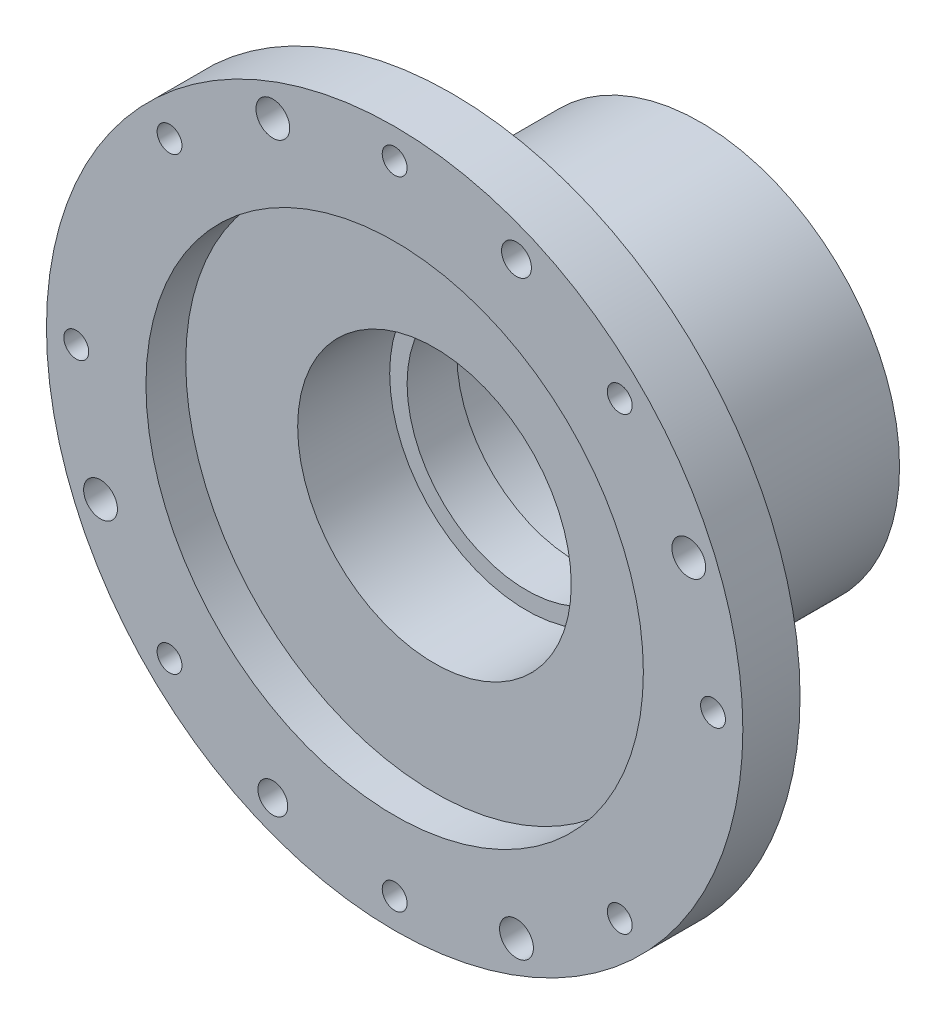
ISO-10303-21;
HEADER;
FILE_DESCRIPTION(('STEP AP214'),'2;1');
FILE_NAME('part.step','',(''),(''),'','','');
FILE_SCHEMA(('AUTOMOTIVE_DESIGN { 1 0 10303 214 1 1 1 1 }'));
ENDSEC;
DATA;
#1=APPLICATION_CONTEXT('core data for automotive mechanical design processes');
#2=APPLICATION_PROTOCOL_DEFINITION('international standard','automotive_design',2000,#1);
#3=PRODUCT_CONTEXT('',#1,'mechanical');
#4=PRODUCT('Part','Part','',(#3));
#5=PRODUCT_RELATED_PRODUCT_CATEGORY('part','',(#4));
#6=PRODUCT_DEFINITION_FORMATION('','',#4);
#7=PRODUCT_DEFINITION_CONTEXT('part definition',#1,'design');
#8=PRODUCT_DEFINITION('design','',#6,#7);
#9=PRODUCT_DEFINITION_SHAPE('','',#8);
#10=(LENGTH_UNIT() NAMED_UNIT(*) SI_UNIT(.MILLI.,.METRE.));
#11=(NAMED_UNIT(*) PLANE_ANGLE_UNIT() SI_UNIT($,.RADIAN.));
#12=(NAMED_UNIT(*) SI_UNIT($,.STERADIAN.) SOLID_ANGLE_UNIT());
#13=UNCERTAINTY_MEASURE_WITH_UNIT(LENGTH_MEASURE(1.E-05),#10,'distance_accuracy_value','');
#14=(GEOMETRIC_REPRESENTATION_CONTEXT(3) GLOBAL_UNCERTAINTY_ASSIGNED_CONTEXT((#13)) GLOBAL_UNIT_ASSIGNED_CONTEXT((#10,
#11,#12)) REPRESENTATION_CONTEXT('',''));
#15=CARTESIAN_POINT('',(0.,0.,0.));
#16=DIRECTION('',(0.,0.,1.));
#17=DIRECTION('',(1.,0.,0.));
#18=AXIS2_PLACEMENT_3D('',#15,#16,#17);
#19=CARTESIAN_POINT('',(0.,0.,150.));
#20=DIRECTION('',(0.,0.,1.));
#21=DIRECTION('',(1.,0.,0.));
#22=AXIS2_PLACEMENT_3D('',#19,#20,#21);
#23=CYLINDRICAL_SURFACE('',#22,27.5);
#24=CARTESIAN_POINT('',(0.,0.,-71.));
#25=DIRECTION('',(0.,0.,1.));
#26=DIRECTION('',(1.,0.,0.));
#27=AXIS2_PLACEMENT_3D('',#24,#25,#26);
#28=CIRCLE('',#27,27.5);
#29=CARTESIAN_POINT('',(27.5,0.,-71.));
#30=VERTEX_POINT('',#29);
#31=EDGE_CURVE('E142',#30,#30,#28,.T.);
#32=ORIENTED_EDGE('',*,*,#31,.T.);
#33=EDGE_LOOP('',(#32));
#34=FACE_BOUND('',#33,.T.);
#35=CARTESIAN_POINT('',(0.,0.,-96.));
#36=DIRECTION('',(0.,0.,1.));
#37=DIRECTION('',(1.,0.,0.));
#38=AXIS2_PLACEMENT_3D('',#35,#36,#37);
#39=CIRCLE('',#38,27.5);
#40=CARTESIAN_POINT('',(27.5,0.,-96.));
#41=VERTEX_POINT('',#40);
#42=EDGE_CURVE('E10',#41,#41,#39,.T.);
#43=ORIENTED_EDGE('',*,*,#42,.F.);
#44=EDGE_LOOP('',(#43));
#45=FACE_BOUND('',#44,.T.);
#46=ADVANCED_FACE('F39',(#34,#45),#23,.F.);
#47=CARTESIAN_POINT('',(27.5,0.,-96.));
#48=DIRECTION('',(0.,0.,-1.));
#49=DIRECTION('',(-1.,0.,0.));
#50=AXIS2_PLACEMENT_3D('',#47,#48,#49);
#51=PLANE('',#50);
#52=CARTESIAN_POINT('',(-23.8649,-23.8649,-96.));
#53=DIRECTION('',(0.,0.,-1.));
#54=DIRECTION('',(-1.,0.,0.));
#55=AXIS2_PLACEMENT_3D('',#52,#53,#54);
#56=CIRCLE('',#55,1.65);
#57=CARTESIAN_POINT('',(-25.5149,-23.8649,-96.));
#58=VERTEX_POINT('',#57);
#59=EDGE_CURVE('E511',#58,#58,#56,.T.);
#60=ORIENTED_EDGE('',*,*,#59,.F.);
#61=EDGE_LOOP('',(#60));
#62=FACE_BOUND('',#61,.T.);
#63=CARTESIAN_POINT('',(23.8649,-23.8649,-96.));
#64=DIRECTION('',(0.,0.,-1.));
#65=DIRECTION('',(-1.,0.,0.));
#66=AXIS2_PLACEMENT_3D('',#63,#64,#65);
#67=CIRCLE('',#66,1.65);
#68=CARTESIAN_POINT('',(22.2149,-23.8649,-96.));
#69=VERTEX_POINT('',#68);
#70=EDGE_CURVE('E645',#69,#69,#67,.T.);
#71=ORIENTED_EDGE('',*,*,#70,.F.);
#72=EDGE_LOOP('',(#71));
#73=FACE_BOUND('',#72,.T.);
#74=CARTESIAN_POINT('',(23.8649,23.8649,-96.));
#75=DIRECTION('',(0.,0.,-1.));
#76=DIRECTION('',(-1.,0.,0.));
#77=AXIS2_PLACEMENT_3D('',#74,#75,#76);
#78=CIRCLE('',#77,1.65);
#79=CARTESIAN_POINT('',(22.2149,23.8649,-96.));
#80=VERTEX_POINT('',#79);
#81=EDGE_CURVE('E527',#80,#80,#78,.T.);
#82=ORIENTED_EDGE('',*,*,#81,.F.);
#83=EDGE_LOOP('',(#82));
#84=FACE_BOUND('',#83,.T.);
#85=CARTESIAN_POINT('',(-23.8649,23.8649,-96.));
#86=DIRECTION('',(0.,0.,-1.));
#87=DIRECTION('',(-1.,0.,0.));
#88=AXIS2_PLACEMENT_3D('',#85,#86,#87);
#89=CIRCLE('',#88,1.65);
#90=CARTESIAN_POINT('',(-25.5149,23.8649,-96.));
#91=VERTEX_POINT('',#90);
#92=EDGE_CURVE('E528',#91,#91,#89,.T.);
#93=ORIENTED_EDGE('',*,*,#92,.F.);
#94=EDGE_LOOP('',(#93));
#95=FACE_BOUND('',#94,.T.);
#96=ORIENTED_EDGE('',*,*,#42,.T.);
#97=EDGE_LOOP('',(#96));
#98=FACE_BOUND('',#97,.T.);
#99=CARTESIAN_POINT('',(0.,0.,-96.));
#100=DIRECTION('',(0.,0.,1.));
#101=DIRECTION('',(1.,0.,0.));
#102=AXIS2_PLACEMENT_3D('',#99,#100,#101);
#103=CIRCLE('',#102,40.);
#104=CARTESIAN_POINT('',(40.,0.,-96.));
#105=VERTEX_POINT('',#104);
#106=EDGE_CURVE('E50',#105,#105,#103,.T.);
#107=ORIENTED_EDGE('',*,*,#106,.F.);
#108=EDGE_LOOP('',(#107));
#109=FACE_BOUND('',#108,.T.);
#110=ADVANCED_FACE('F187',(#62,#73,#84,#95,#98,#109),#51,.T.);
#111=CARTESIAN_POINT('',(0.,0.,150.));
#112=DIRECTION('',(0.,0.,1.));
#113=DIRECTION('',(1.,0.,0.));
#114=AXIS2_PLACEMENT_3D('',#111,#112,#113);
#115=CYLINDRICAL_SURFACE('',#114,40.);
#116=ORIENTED_EDGE('',*,*,#106,.T.);
#117=EDGE_LOOP('',(#116));
#118=FACE_BOUND('',#117,.T.);
#119=CARTESIAN_POINT('',(0.,0.,-46.));
#120=DIRECTION('',(0.,0.,1.));
#121=DIRECTION('',(1.,0.,0.));
#122=AXIS2_PLACEMENT_3D('',#119,#120,#121);
#123=CIRCLE('',#122,40.);
#124=CARTESIAN_POINT('',(40.,0.,-46.));
#125=VERTEX_POINT('',#124);
#126=EDGE_CURVE('E53',#125,#125,#123,.T.);
#127=ORIENTED_EDGE('',*,*,#126,.F.);
#128=EDGE_LOOP('',(#127));
#129=FACE_BOUND('',#128,.T.);
#130=ADVANCED_FACE('F183',(#118,#129),#115,.T.);
#131=CARTESIAN_POINT('',(40.,0.,-46.));
#132=DIRECTION('',(0.,0.,-1.));
#133=DIRECTION('',(-1.,0.,0.));
#134=AXIS2_PLACEMENT_3D('',#131,#132,#133);
#135=PLANE('',#134);
#136=CARTESIAN_POINT('',(24.4917,59.1283,-46.));
#137=DIRECTION('',(0.,0.,-1.));
#138=DIRECTION('',(-1.,0.,0.));
#139=AXIS2_PLACEMENT_3D('',#136,#137,#138);
#140=CIRCLE('',#139,3.);
#141=CARTESIAN_POINT('',(21.4917,59.1283,-46.));
#142=VERTEX_POINT('',#141);
#143=EDGE_CURVE('E140',#142,#142,#140,.F.);
#144=ORIENTED_EDGE('',*,*,#143,.T.);
#145=EDGE_LOOP('',(#144));
#146=FACE_BOUND('',#145,.T.);
#147=CARTESIAN_POINT('',(45.2548,-45.2548,-46.));
#148=DIRECTION('',(0.,0.,-1.));
#149=DIRECTION('',(-1.,0.,0.));
#150=AXIS2_PLACEMENT_3D('',#147,#148,#149);
#151=CIRCLE('',#150,2.5);
#152=CARTESIAN_POINT('',(42.7548,-45.2548,-46.));
#153=VERTEX_POINT('',#152);
#154=EDGE_CURVE('E122',#153,#153,#151,.F.);
#155=ORIENTED_EDGE('',*,*,#154,.T.);
#156=EDGE_LOOP('',(#155));
#157=FACE_BOUND('',#156,.T.);
#158=CARTESIAN_POINT('',(0.,-64.,-46.));
#159=DIRECTION('',(0.,0.,-1.));
#160=DIRECTION('',(-1.,0.,0.));
#161=AXIS2_PLACEMENT_3D('',#158,#159,#160);
#162=CIRCLE('',#161,2.5);
#163=CARTESIAN_POINT('',(-2.5,-64.,-46.));
#164=VERTEX_POINT('',#163);
#165=EDGE_CURVE('E120',#164,#164,#162,.F.);
#166=ORIENTED_EDGE('',*,*,#165,.T.);
#167=EDGE_LOOP('',(#166));
#168=FACE_BOUND('',#167,.T.);
#169=CARTESIAN_POINT('',(-45.2548,-45.2548,-46.));
#170=DIRECTION('',(0.,0.,-1.));
#171=DIRECTION('',(-1.,0.,0.));
#172=AXIS2_PLACEMENT_3D('',#169,#170,#171);
#173=CIRCLE('',#172,2.5);
#174=CARTESIAN_POINT('',(-47.7548,-45.2548,-46.));
#175=VERTEX_POINT('',#174);
#176=EDGE_CURVE('E113',#175,#175,#173,.F.);
#177=ORIENTED_EDGE('',*,*,#176,.T.);
#178=EDGE_LOOP('',(#177));
#179=FACE_BOUND('',#178,.T.);
#180=CARTESIAN_POINT('',(-64.,0.,-46.));
#181=DIRECTION('',(0.,0.,-1.));
#182=DIRECTION('',(-1.,0.,0.));
#183=AXIS2_PLACEMENT_3D('',#180,#181,#182);
#184=CIRCLE('',#183,2.5);
#185=CARTESIAN_POINT('',(-66.5,0.,-46.));
#186=VERTEX_POINT('',#185);
#187=EDGE_CURVE('E108',#186,#186,#184,.F.);
#188=ORIENTED_EDGE('',*,*,#187,.T.);
#189=EDGE_LOOP('',(#188));
#190=FACE_BOUND('',#189,.T.);
#191=CARTESIAN_POINT('',(-45.2548,45.2548,-46.));
#192=DIRECTION('',(0.,0.,-1.));
#193=DIRECTION('',(-1.,0.,0.));
#194=AXIS2_PLACEMENT_3D('',#191,#192,#193);
#195=CIRCLE('',#194,2.5);
#196=CARTESIAN_POINT('',(-47.7548,45.2548,-46.));
#197=VERTEX_POINT('',#196);
#198=EDGE_CURVE('E101',#197,#197,#195,.F.);
#199=ORIENTED_EDGE('',*,*,#198,.T.);
#200=EDGE_LOOP('',(#199));
#201=FACE_BOUND('',#200,.T.);
#202=CARTESIAN_POINT('',(0.,64.,-46.));
#203=DIRECTION('',(0.,0.,-1.));
#204=DIRECTION('',(-1.,0.,0.));
#205=AXIS2_PLACEMENT_3D('',#202,#203,#204);
#206=CIRCLE('',#205,2.5);
#207=CARTESIAN_POINT('',(-2.5,64.,-46.));
#208=VERTEX_POINT('',#207);
#209=EDGE_CURVE('E96',#208,#208,#206,.F.);
#210=ORIENTED_EDGE('',*,*,#209,.T.);
#211=EDGE_LOOP('',(#210));
#212=FACE_BOUND('',#211,.T.);
#213=CARTESIAN_POINT('',(45.2548,45.2548,-46.));
#214=DIRECTION('',(0.,0.,-1.));
#215=DIRECTION('',(-1.,0.,0.));
#216=AXIS2_PLACEMENT_3D('',#213,#214,#215);
#217=CIRCLE('',#216,2.5);
#218=CARTESIAN_POINT('',(42.7548,45.2548,-46.));
#219=VERTEX_POINT('',#218);
#220=EDGE_CURVE('E91',#219,#219,#217,.F.);
#221=ORIENTED_EDGE('',*,*,#220,.T.);
#222=EDGE_LOOP('',(#221));
#223=FACE_BOUND('',#222,.T.);
#224=CARTESIAN_POINT('',(24.4917,-59.1283,-46.));
#225=DIRECTION('',(0.,0.,-1.));
#226=DIRECTION('',(-1.,0.,0.));
#227=AXIS2_PLACEMENT_3D('',#224,#225,#226);
#228=CIRCLE('',#227,3.4);
#229=CARTESIAN_POINT('',(21.0917,-59.1283,-46.));
#230=VERTEX_POINT('',#229);
#231=EDGE_CURVE('E89',#230,#230,#228,.F.);
#232=ORIENTED_EDGE('',*,*,#231,.T.);
#233=EDGE_LOOP('',(#232));
#234=FACE_BOUND('',#233,.T.);
#235=CARTESIAN_POINT('',(-24.4917,-59.1283,-46.));
#236=DIRECTION('',(0.,0.,-1.));
#237=DIRECTION('',(-1.,0.,0.));
#238=AXIS2_PLACEMENT_3D('',#235,#236,#237);
#239=CIRCLE('',#238,3.);
#240=CARTESIAN_POINT('',(-27.4917,-59.1283,-46.));
#241=VERTEX_POINT('',#240);
#242=EDGE_CURVE('E84',#241,#241,#239,.F.);
#243=ORIENTED_EDGE('',*,*,#242,.T.);
#244=EDGE_LOOP('',(#243));
#245=FACE_BOUND('',#244,.T.);
#246=CARTESIAN_POINT('',(59.1283,24.4917,-46.));
#247=DIRECTION('',(0.,0.,-1.));
#248=DIRECTION('',(-1.,0.,0.));
#249=AXIS2_PLACEMENT_3D('',#246,#247,#248);
#250=CIRCLE('',#249,3.39999999999999);
#251=CARTESIAN_POINT('',(55.7283,24.4917,-46.));
#252=VERTEX_POINT('',#251);
#253=EDGE_CURVE('E76',#252,#252,#250,.F.);
#254=ORIENTED_EDGE('',*,*,#253,.T.);
#255=EDGE_LOOP('',(#254));
#256=FACE_BOUND('',#255,.T.);
#257=CARTESIAN_POINT('',(-24.4917,59.1283,-46.));
#258=DIRECTION('',(0.,0.,-1.));
#259=DIRECTION('',(-1.,0.,0.));
#260=AXIS2_PLACEMENT_3D('',#257,#258,#259);
#261=CIRCLE('',#260,3.4);
#262=CARTESIAN_POINT('',(-27.8917,59.1283,-46.));
#263=VERTEX_POINT('',#262);
#264=EDGE_CURVE('E71',#263,#263,#261,.F.);
#265=ORIENTED_EDGE('',*,*,#264,.T.);
#266=EDGE_LOOP('',(#265));
#267=FACE_BOUND('',#266,.T.);
#268=CARTESIAN_POINT('',(-59.1283,-24.4917,-46.));
#269=DIRECTION('',(0.,0.,-1.));
#270=DIRECTION('',(-1.,0.,0.));
#271=AXIS2_PLACEMENT_3D('',#268,#269,#270);
#272=CIRCLE('',#271,3.4);
#273=CARTESIAN_POINT('',(-62.5283,-24.4917,-46.));
#274=VERTEX_POINT('',#273);
#275=EDGE_CURVE('E69',#274,#274,#272,.F.);
#276=ORIENTED_EDGE('',*,*,#275,.T.);
#277=EDGE_LOOP('',(#276));
#278=FACE_BOUND('',#277,.T.);
#279=CARTESIAN_POINT('',(64.,0.,-46.));
#280=DIRECTION('',(0.,0.,-1.));
#281=DIRECTION('',(-1.,0.,0.));
#282=AXIS2_PLACEMENT_3D('',#279,#280,#281);
#283=CIRCLE('',#282,2.5);
#284=CARTESIAN_POINT('',(61.5,0.,-46.));
#285=VERTEX_POINT('',#284);
#286=EDGE_CURVE('E65',#285,#285,#283,.F.);
#287=ORIENTED_EDGE('',*,*,#286,.T.);
#288=EDGE_LOOP('',(#287));
#289=FACE_BOUND('',#288,.T.);
#290=ORIENTED_EDGE('',*,*,#126,.T.);
#291=EDGE_LOOP('',(#290));
#292=FACE_BOUND('',#291,.T.);
#293=CARTESIAN_POINT('',(0.,0.,-46.));
#294=DIRECTION('',(0.,0.,1.));
#295=DIRECTION('',(1.,0.,0.));
#296=AXIS2_PLACEMENT_3D('',#293,#294,#295);
#297=CIRCLE('',#296,70.);
#298=CARTESIAN_POINT('',(70.,0.,-46.));
#299=VERTEX_POINT('',#298);
#300=EDGE_CURVE('E173',#299,#299,#297,.T.);
#301=ORIENTED_EDGE('',*,*,#300,.F.);
#302=EDGE_LOOP('',(#301));
#303=FACE_BOUND('',#302,.T.);
#304=ADVANCED_FACE('F181',(#146,#157,#168,#179,#190,#201,#212,#223,#234,#245,#256,#267,#278,
#289,#292,#303),#135,.T.);
#305=CARTESIAN_POINT('',(0.,0.,150.));
#306=DIRECTION('',(0.,0.,1.));
#307=DIRECTION('',(1.,0.,0.));
#308=AXIS2_PLACEMENT_3D('',#305,#306,#307);
#309=CYLINDRICAL_SURFACE('',#308,70.);
#310=ORIENTED_EDGE('',*,*,#300,.T.);
#311=EDGE_LOOP('',(#310));
#312=FACE_BOUND('',#311,.T.);
#313=CARTESIAN_POINT('',(0.,0.,-34.5));
#314=DIRECTION('',(0.,0.,1.));
#315=DIRECTION('',(1.,0.,0.));
#316=AXIS2_PLACEMENT_3D('',#313,#314,#315);
#317=CIRCLE('',#316,70.);
#318=CARTESIAN_POINT('',(70.,0.,-34.5));
#319=VERTEX_POINT('',#318);
#320=EDGE_CURVE('E169',#319,#319,#317,.T.);
#321=ORIENTED_EDGE('',*,*,#320,.F.);
#322=EDGE_LOOP('',(#321));
#323=FACE_BOUND('',#322,.T.);
#324=ADVANCED_FACE('F191',(#312,#323),#309,.T.);
#325=CARTESIAN_POINT('',(70.,0.,-34.5));
#326=DIRECTION('',(0.,0.,1.));
#327=DIRECTION('',(1.,0.,0.));
#328=AXIS2_PLACEMENT_3D('',#325,#326,#327);
#329=PLANE('',#328);
#330=CARTESIAN_POINT('',(24.4917,59.1283,-34.5));
#331=DIRECTION('',(0.,0.,1.));
#332=DIRECTION('',(1.,0.,0.));
#333=AXIS2_PLACEMENT_3D('',#330,#331,#332);
#334=CIRCLE('',#333,3.);
#335=CARTESIAN_POINT('',(27.4917,59.1283,-34.5));
#336=VERTEX_POINT('',#335);
#337=EDGE_CURVE('E45',#336,#336,#334,.F.);
#338=ORIENTED_EDGE('',*,*,#337,.T.);
#339=EDGE_LOOP('',(#338));
#340=FACE_BOUND('',#339,.T.);
#341=CARTESIAN_POINT('',(45.2548,-45.2548,-34.5));
#342=DIRECTION('',(0.,0.,1.));
#343=DIRECTION('',(1.,0.,0.));
#344=AXIS2_PLACEMENT_3D('',#341,#342,#343);
#345=CIRCLE('',#344,2.5);
#346=CARTESIAN_POINT('',(47.7548,-45.2548,-34.5));
#347=VERTEX_POINT('',#346);
#348=EDGE_CURVE('E117',#347,#347,#345,.F.);
#349=ORIENTED_EDGE('',*,*,#348,.T.);
#350=EDGE_LOOP('',(#349));
#351=FACE_BOUND('',#350,.T.);
#352=CARTESIAN_POINT('',(0.,-64.,-34.5));
#353=DIRECTION('',(0.,0.,1.));
#354=DIRECTION('',(1.,0.,0.));
#355=AXIS2_PLACEMENT_3D('',#352,#353,#354);
#356=CIRCLE('',#355,2.5);
#357=CARTESIAN_POINT('',(2.5,-64.,-34.5));
#358=VERTEX_POINT('',#357);
#359=EDGE_CURVE('E112',#358,#358,#356,.F.);
#360=ORIENTED_EDGE('',*,*,#359,.T.);
#361=EDGE_LOOP('',(#360));
#362=FACE_BOUND('',#361,.T.);
#363=CARTESIAN_POINT('',(-45.2548,-45.2548,-34.5));
#364=DIRECTION('',(0.,0.,1.));
#365=DIRECTION('',(1.,0.,0.));
#366=AXIS2_PLACEMENT_3D('',#363,#364,#365);
#367=CIRCLE('',#366,2.5);
#368=CARTESIAN_POINT('',(-42.7548,-45.2548,-34.5));
#369=VERTEX_POINT('',#368);
#370=EDGE_CURVE('E107',#369,#369,#367,.F.);
#371=ORIENTED_EDGE('',*,*,#370,.T.);
#372=EDGE_LOOP('',(#371));
#373=FACE_BOUND('',#372,.T.);
#374=CARTESIAN_POINT('',(-64.,0.,-34.5));
#375=DIRECTION('',(0.,0.,1.));
#376=DIRECTION('',(1.,0.,0.));
#377=AXIS2_PLACEMENT_3D('',#374,#375,#376);
#378=CIRCLE('',#377,2.5);
#379=CARTESIAN_POINT('',(-61.5,0.,-34.5));
#380=VERTEX_POINT('',#379);
#381=EDGE_CURVE('E104',#380,#380,#378,.F.);
#382=ORIENTED_EDGE('',*,*,#381,.T.);
#383=EDGE_LOOP('',(#382));
#384=FACE_BOUND('',#383,.T.);
#385=CARTESIAN_POINT('',(-45.2548,45.2548,-34.5));
#386=DIRECTION('',(0.,0.,1.));
#387=DIRECTION('',(1.,0.,0.));
#388=AXIS2_PLACEMENT_3D('',#385,#386,#387);
#389=CIRCLE('',#388,2.5);
#390=CARTESIAN_POINT('',(-42.7548,45.2548,-34.5));
#391=VERTEX_POINT('',#390);
#392=EDGE_CURVE('E100',#391,#391,#389,.F.);
#393=ORIENTED_EDGE('',*,*,#392,.T.);
#394=EDGE_LOOP('',(#393));
#395=FACE_BOUND('',#394,.T.);
#396=CARTESIAN_POINT('',(0.,64.,-34.5));
#397=DIRECTION('',(0.,0.,1.));
#398=DIRECTION('',(1.,0.,0.));
#399=AXIS2_PLACEMENT_3D('',#396,#397,#398);
#400=CIRCLE('',#399,2.5);
#401=CARTESIAN_POINT('',(2.5,64.,-34.5));
#402=VERTEX_POINT('',#401);
#403=EDGE_CURVE('E94',#402,#402,#400,.F.);
#404=ORIENTED_EDGE('',*,*,#403,.T.);
#405=EDGE_LOOP('',(#404));
#406=FACE_BOUND('',#405,.T.);
#407=CARTESIAN_POINT('',(45.2548,45.2548,-34.5));
#408=DIRECTION('',(0.,0.,1.));
#409=DIRECTION('',(1.,0.,0.));
#410=AXIS2_PLACEMENT_3D('',#407,#408,#409);
#411=CIRCLE('',#410,2.5);
#412=CARTESIAN_POINT('',(47.7548,45.2548,-34.5));
#413=VERTEX_POINT('',#412);
#414=EDGE_CURVE('E86',#413,#413,#411,.F.);
#415=ORIENTED_EDGE('',*,*,#414,.T.);
#416=EDGE_LOOP('',(#415));
#417=FACE_BOUND('',#416,.T.);
#418=CARTESIAN_POINT('',(24.4917,-59.1283,-34.5));
#419=DIRECTION('',(0.,0.,1.));
#420=DIRECTION('',(1.,0.,0.));
#421=AXIS2_PLACEMENT_3D('',#418,#419,#420);
#422=CIRCLE('',#421,3.4);
#423=CARTESIAN_POINT('',(27.8917,-59.1283,-34.5));
#424=VERTEX_POINT('',#423);
#425=EDGE_CURVE('E81',#424,#424,#422,.F.);
#426=ORIENTED_EDGE('',*,*,#425,.T.);
#427=EDGE_LOOP('',(#426));
#428=FACE_BOUND('',#427,.T.);
#429=CARTESIAN_POINT('',(-24.4917,-59.1283,-34.5));
#430=DIRECTION('',(0.,0.,1.));
#431=DIRECTION('',(1.,0.,0.));
#432=AXIS2_PLACEMENT_3D('',#429,#430,#431);
#433=CIRCLE('',#432,3.);
#434=CARTESIAN_POINT('',(-21.4917,-59.1283,-34.5));
#435=VERTEX_POINT('',#434);
#436=EDGE_CURVE('E79',#435,#435,#433,.F.);
#437=ORIENTED_EDGE('',*,*,#436,.T.);
#438=EDGE_LOOP('',(#437));
#439=FACE_BOUND('',#438,.T.);
#440=CARTESIAN_POINT('',(59.1283,24.4917,-34.5));
#441=DIRECTION('',(0.,0.,1.));
#442=DIRECTION('',(1.,0.,0.));
#443=AXIS2_PLACEMENT_3D('',#440,#441,#442);
#444=CIRCLE('',#443,3.39999999999999);
#445=CARTESIAN_POINT('',(62.5283,24.4917,-34.5));
#446=VERTEX_POINT('',#445);
#447=EDGE_CURVE('E74',#446,#446,#444,.F.);
#448=ORIENTED_EDGE('',*,*,#447,.T.);
#449=EDGE_LOOP('',(#448));
#450=FACE_BOUND('',#449,.T.);
#451=CARTESIAN_POINT('',(-24.4917,59.1283,-34.5));
#452=DIRECTION('',(0.,0.,1.));
#453=DIRECTION('',(1.,0.,0.));
#454=AXIS2_PLACEMENT_3D('',#451,#452,#453);
#455=CIRCLE('',#454,3.4);
#456=CARTESIAN_POINT('',(-21.0917,59.1283,-34.5));
#457=VERTEX_POINT('',#456);
#458=EDGE_CURVE('E66',#457,#457,#455,.F.);
#459=ORIENTED_EDGE('',*,*,#458,.T.);
#460=EDGE_LOOP('',(#459));
#461=FACE_BOUND('',#460,.T.);
#462=CARTESIAN_POINT('',(-59.1283,-24.4917,-34.5));
#463=DIRECTION('',(0.,0.,1.));
#464=DIRECTION('',(1.,0.,0.));
#465=AXIS2_PLACEMENT_3D('',#462,#463,#464);
#466=CIRCLE('',#465,3.4);
#467=CARTESIAN_POINT('',(-55.7283,-24.4917,-34.5));
#468=VERTEX_POINT('',#467);
#469=EDGE_CURVE('E61',#468,#468,#466,.F.);
#470=ORIENTED_EDGE('',*,*,#469,.T.);
#471=EDGE_LOOP('',(#470));
#472=FACE_BOUND('',#471,.T.);
#473=CARTESIAN_POINT('',(64.,0.,-34.5));
#474=DIRECTION('',(0.,0.,1.));
#475=DIRECTION('',(1.,0.,0.));
#476=AXIS2_PLACEMENT_3D('',#473,#474,#475);
#477=CIRCLE('',#476,2.5);
#478=CARTESIAN_POINT('',(66.5,0.,-34.5));
#479=VERTEX_POINT('',#478);
#480=EDGE_CURVE('E59',#479,#479,#477,.F.);
#481=ORIENTED_EDGE('',*,*,#480,.T.);
#482=EDGE_LOOP('',(#481));
#483=FACE_BOUND('',#482,.T.);
#484=ORIENTED_EDGE('',*,*,#320,.T.);
#485=EDGE_LOOP('',(#484));
#486=FACE_BOUND('',#485,.T.);
#487=CARTESIAN_POINT('',(0.,0.,-34.5));
#488=DIRECTION('',(0.,0.,1.));
#489=DIRECTION('',(1.,0.,0.));
#490=AXIS2_PLACEMENT_3D('',#487,#488,#489);
#491=CIRCLE('',#490,50.);
#492=CARTESIAN_POINT('',(50.,0.,-34.5));
#493=VERTEX_POINT('',#492);
#494=EDGE_CURVE('E164',#493,#493,#491,.T.);
#495=ORIENTED_EDGE('',*,*,#494,.F.);
#496=EDGE_LOOP('',(#495));
#497=FACE_BOUND('',#496,.T.);
#498=ADVANCED_FACE('F240',(#340,#351,#362,#373,#384,#395,#406,#417,#428,#439,#450,#461,#472,
#483,#486,#497),#329,.T.);
#499=CARTESIAN_POINT('',(0.,0.,150.));
#500=DIRECTION('',(0.,0.,1.));
#501=DIRECTION('',(1.,0.,0.));
#502=AXIS2_PLACEMENT_3D('',#499,#500,#501);
#503=CYLINDRICAL_SURFACE('',#502,50.);
#504=ORIENTED_EDGE('',*,*,#494,.T.);
#505=EDGE_LOOP('',(#504));
#506=FACE_BOUND('',#505,.T.);
#507=CARTESIAN_POINT('',(0.,0.,-42.5));
#508=DIRECTION('',(0.,0.,1.));
#509=DIRECTION('',(1.,0.,0.));
#510=AXIS2_PLACEMENT_3D('',#507,#508,#509);
#511=CIRCLE('',#510,50.);
#512=CARTESIAN_POINT('',(50.,0.,-42.5));
#513=VERTEX_POINT('',#512);
#514=EDGE_CURVE('E163',#513,#513,#511,.T.);
#515=ORIENTED_EDGE('',*,*,#514,.F.);
#516=EDGE_LOOP('',(#515));
#517=FACE_BOUND('',#516,.T.);
#518=ADVANCED_FACE('F231',(#506,#517),#503,.F.);
#519=CARTESIAN_POINT('',(50.,0.,-42.5));
#520=DIRECTION('',(0.,0.,1.));
#521=DIRECTION('',(1.,0.,0.));
#522=AXIS2_PLACEMENT_3D('',#519,#520,#521);
#523=PLANE('',#522);
#524=ORIENTED_EDGE('',*,*,#514,.T.);
#525=EDGE_LOOP('',(#524));
#526=FACE_BOUND('',#525,.T.);
#527=CARTESIAN_POINT('',(0.,0.,-42.5));
#528=DIRECTION('',(0.,0.,1.));
#529=DIRECTION('',(1.,0.,0.));
#530=AXIS2_PLACEMENT_3D('',#527,#528,#529);
#531=CIRCLE('',#530,27.5);
#532=CARTESIAN_POINT('',(27.5,0.,-42.5));
#533=VERTEX_POINT('',#532);
#534=EDGE_CURVE('E160',#533,#533,#531,.T.);
#535=ORIENTED_EDGE('',*,*,#534,.F.);
#536=EDGE_LOOP('',(#535));
#537=FACE_BOUND('',#536,.T.);
#538=ADVANCED_FACE('F230',(#526,#537),#523,.T.);
#539=CARTESIAN_POINT('',(0.,0.,150.));
#540=DIRECTION('',(0.,0.,1.));
#541=DIRECTION('',(1.,0.,0.));
#542=AXIS2_PLACEMENT_3D('',#539,#540,#541);
#543=CYLINDRICAL_SURFACE('',#542,27.5);
#544=ORIENTED_EDGE('',*,*,#534,.T.);
#545=EDGE_LOOP('',(#544));
#546=FACE_BOUND('',#545,.T.);
#547=CARTESIAN_POINT('',(0.,0.,-61.));
#548=DIRECTION('',(0.,0.,1.));
#549=DIRECTION('',(1.,0.,0.));
#550=AXIS2_PLACEMENT_3D('',#547,#548,#549);
#551=CIRCLE('',#550,27.5);
#552=CARTESIAN_POINT('',(27.5,0.,-61.));
#553=VERTEX_POINT('',#552);
#554=EDGE_CURVE('E154',#553,#553,#551,.T.);
#555=ORIENTED_EDGE('',*,*,#554,.F.);
#556=EDGE_LOOP('',(#555));
#557=FACE_BOUND('',#556,.T.);
#558=ADVANCED_FACE('F222',(#546,#557),#543,.F.);
#559=CARTESIAN_POINT('',(27.5,0.,-61.));
#560=DIRECTION('',(0.,0.,1.));
#561=DIRECTION('',(1.,0.,0.));
#562=AXIS2_PLACEMENT_3D('',#559,#560,#561);
#563=PLANE('',#562);
#564=ORIENTED_EDGE('',*,*,#554,.T.);
#565=EDGE_LOOP('',(#564));
#566=FACE_BOUND('',#565,.T.);
#567=CARTESIAN_POINT('',(0.,0.,-61.));
#568=DIRECTION('',(0.,0.,1.));
#569=DIRECTION('',(1.,0.,0.));
#570=AXIS2_PLACEMENT_3D('',#567,#568,#569);
#571=CIRCLE('',#570,24.);
#572=CARTESIAN_POINT('',(24.,0.,-61.));
#573=VERTEX_POINT('',#572);
#574=EDGE_CURVE('E146',#573,#573,#571,.T.);
#575=ORIENTED_EDGE('',*,*,#574,.F.);
#576=EDGE_LOOP('',(#575));
#577=FACE_BOUND('',#576,.T.);
#578=ADVANCED_FACE('F219',(#566,#577),#563,.T.);
#579=CARTESIAN_POINT('',(0.,0.,150.));
#580=DIRECTION('',(0.,0.,1.));
#581=DIRECTION('',(1.,0.,0.));
#582=AXIS2_PLACEMENT_3D('',#579,#580,#581);
#583=CYLINDRICAL_SURFACE('',#582,24.);
#584=ORIENTED_EDGE('',*,*,#574,.T.);
#585=EDGE_LOOP('',(#584));
#586=FACE_BOUND('',#585,.T.);
#587=CARTESIAN_POINT('',(0.,0.,-71.));
#588=DIRECTION('',(0.,0.,1.));
#589=DIRECTION('',(1.,0.,0.));
#590=AXIS2_PLACEMENT_3D('',#587,#588,#589);
#591=CIRCLE('',#590,24.);
#592=CARTESIAN_POINT('',(24.,0.,-71.));
#593=VERTEX_POINT('',#592);
#594=EDGE_CURVE('E143',#593,#593,#591,.T.);
#595=ORIENTED_EDGE('',*,*,#594,.F.);
#596=EDGE_LOOP('',(#595));
#597=FACE_BOUND('',#596,.T.);
#598=ADVANCED_FACE('F206',(#586,#597),#583,.F.);
#599=CARTESIAN_POINT('',(24.,0.,-71.));
#600=DIRECTION('',(0.,0.,-1.));
#601=DIRECTION('',(-1.,0.,0.));
#602=AXIS2_PLACEMENT_3D('',#599,#600,#601);
#603=PLANE('',#602);
#604=ORIENTED_EDGE('',*,*,#594,.T.);
#605=EDGE_LOOP('',(#604));
#606=FACE_BOUND('',#605,.T.);
#607=ORIENTED_EDGE('',*,*,#31,.F.);
#608=EDGE_LOOP('',(#607));
#609=FACE_BOUND('',#608,.T.);
#610=ADVANCED_FACE('F202',(#606,#609),#603,.T.);
#611=CARTESIAN_POINT('',(64.,0.,150.));
#612=DIRECTION('',(0.,0.,-1.));
#613=DIRECTION('',(-1.,0.,0.));
#614=AXIS2_PLACEMENT_3D('',#611,#612,#613);
#615=CYLINDRICAL_SURFACE('',#614,2.5);
#616=ORIENTED_EDGE('',*,*,#286,.F.);
#617=EDGE_LOOP('',(#616));
#618=FACE_BOUND('',#617,.T.);
#619=ORIENTED_EDGE('',*,*,#480,.F.);
#620=EDGE_LOOP('',(#619));
#621=FACE_BOUND('',#620,.T.);
#622=ADVANCED_FACE('F210',(#618,#621),#615,.F.);
#623=CARTESIAN_POINT('',(-59.1283,-24.4917,150.));
#624=DIRECTION('',(0.,0.,-1.));
#625=DIRECTION('',(-1.,0.,0.));
#626=AXIS2_PLACEMENT_3D('',#623,#624,#625);
#627=CYLINDRICAL_SURFACE('',#626,3.4);
#628=ORIENTED_EDGE('',*,*,#275,.F.);
#629=EDGE_LOOP('',(#628));
#630=FACE_BOUND('',#629,.T.);
#631=ORIENTED_EDGE('',*,*,#469,.F.);
#632=EDGE_LOOP('',(#631));
#633=FACE_BOUND('',#632,.T.);
#634=ADVANCED_FACE('F213',(#630,#633),#627,.F.);
#635=CARTESIAN_POINT('',(-24.4917,59.1283,150.));
#636=DIRECTION('',(0.,0.,-1.));
#637=DIRECTION('',(-1.,0.,0.));
#638=AXIS2_PLACEMENT_3D('',#635,#636,#637);
#639=CYLINDRICAL_SURFACE('',#638,3.4);
#640=ORIENTED_EDGE('',*,*,#264,.F.);
#641=EDGE_LOOP('',(#640));
#642=FACE_BOUND('',#641,.T.);
#643=ORIENTED_EDGE('',*,*,#458,.F.);
#644=EDGE_LOOP('',(#643));
#645=FACE_BOUND('',#644,.T.);
#646=ADVANCED_FACE('F308',(#642,#645),#639,.F.);
#647=CARTESIAN_POINT('',(59.1283,24.4917,150.));
#648=DIRECTION('',(0.,0.,-1.));
#649=DIRECTION('',(-1.,0.,0.));
#650=AXIS2_PLACEMENT_3D('',#647,#648,#649);
#651=CYLINDRICAL_SURFACE('',#650,3.39999999999999);
#652=ORIENTED_EDGE('',*,*,#253,.F.);
#653=EDGE_LOOP('',(#652));
#654=FACE_BOUND('',#653,.T.);
#655=ORIENTED_EDGE('',*,*,#447,.F.);
#656=EDGE_LOOP('',(#655));
#657=FACE_BOUND('',#656,.T.);
#658=ADVANCED_FACE('F319',(#654,#657),#651,.F.);
#659=CARTESIAN_POINT('',(-24.4917,-59.1283,150.));
#660=DIRECTION('',(0.,0.,-1.));
#661=DIRECTION('',(-1.,0.,0.));
#662=AXIS2_PLACEMENT_3D('',#659,#660,#661);
#663=CYLINDRICAL_SURFACE('',#662,3.);
#664=ORIENTED_EDGE('',*,*,#242,.F.);
#665=EDGE_LOOP('',(#664));
#666=FACE_BOUND('',#665,.T.);
#667=ORIENTED_EDGE('',*,*,#436,.F.);
#668=EDGE_LOOP('',(#667));
#669=FACE_BOUND('',#668,.T.);
#670=ADVANCED_FACE('F329',(#666,#669),#663,.F.);
#671=CARTESIAN_POINT('',(24.4917,-59.1283,150.));
#672=DIRECTION('',(0.,0.,-1.));
#673=DIRECTION('',(-1.,0.,0.));
#674=AXIS2_PLACEMENT_3D('',#671,#672,#673);
#675=CYLINDRICAL_SURFACE('',#674,3.4);
#676=ORIENTED_EDGE('',*,*,#231,.F.);
#677=EDGE_LOOP('',(#676));
#678=FACE_BOUND('',#677,.T.);
#679=ORIENTED_EDGE('',*,*,#425,.F.);
#680=EDGE_LOOP('',(#679));
#681=FACE_BOUND('',#680,.T.);
#682=ADVANCED_FACE('F336',(#678,#681),#675,.F.);
#683=CARTESIAN_POINT('',(45.2548,45.2548,150.));
#684=DIRECTION('',(0.,0.,-1.));
#685=DIRECTION('',(-1.,0.,0.));
#686=AXIS2_PLACEMENT_3D('',#683,#684,#685);
#687=CYLINDRICAL_SURFACE('',#686,2.5);
#688=ORIENTED_EDGE('',*,*,#220,.F.);
#689=EDGE_LOOP('',(#688));
#690=FACE_BOUND('',#689,.T.);
#691=ORIENTED_EDGE('',*,*,#414,.F.);
#692=EDGE_LOOP('',(#691));
#693=FACE_BOUND('',#692,.T.);
#694=ADVANCED_FACE('F349',(#690,#693),#687,.F.);
#695=CARTESIAN_POINT('',(0.,64.,150.));
#696=DIRECTION('',(0.,0.,-1.));
#697=DIRECTION('',(-1.,0.,0.));
#698=AXIS2_PLACEMENT_3D('',#695,#696,#697);
#699=CYLINDRICAL_SURFACE('',#698,2.5);
#700=ORIENTED_EDGE('',*,*,#209,.F.);
#701=EDGE_LOOP('',(#700));
#702=FACE_BOUND('',#701,.T.);
#703=ORIENTED_EDGE('',*,*,#403,.F.);
#704=EDGE_LOOP('',(#703));
#705=FACE_BOUND('',#704,.T.);
#706=ADVANCED_FACE('F356',(#702,#705),#699,.F.);
#707=CARTESIAN_POINT('',(-45.2548,45.2548,150.));
#708=DIRECTION('',(0.,0.,-1.));
#709=DIRECTION('',(-1.,0.,0.));
#710=AXIS2_PLACEMENT_3D('',#707,#708,#709);
#711=CYLINDRICAL_SURFACE('',#710,2.5);
#712=ORIENTED_EDGE('',*,*,#198,.F.);
#713=EDGE_LOOP('',(#712));
#714=FACE_BOUND('',#713,.T.);
#715=ORIENTED_EDGE('',*,*,#392,.F.);
#716=EDGE_LOOP('',(#715));
#717=FACE_BOUND('',#716,.T.);
#718=ADVANCED_FACE('F368',(#714,#717),#711,.F.);
#719=CARTESIAN_POINT('',(-64.,0.,150.));
#720=DIRECTION('',(0.,0.,-1.));
#721=DIRECTION('',(-1.,0.,0.));
#722=AXIS2_PLACEMENT_3D('',#719,#720,#721);
#723=CYLINDRICAL_SURFACE('',#722,2.5);
#724=ORIENTED_EDGE('',*,*,#187,.F.);
#725=EDGE_LOOP('',(#724));
#726=FACE_BOUND('',#725,.T.);
#727=ORIENTED_EDGE('',*,*,#381,.F.);
#728=EDGE_LOOP('',(#727));
#729=FACE_BOUND('',#728,.T.);
#730=ADVANCED_FACE('F377',(#726,#729),#723,.F.);
#731=CARTESIAN_POINT('',(-45.2548,-45.2548,150.));
#732=DIRECTION('',(0.,0.,-1.));
#733=DIRECTION('',(-1.,0.,0.));
#734=AXIS2_PLACEMENT_3D('',#731,#732,#733);
#735=CYLINDRICAL_SURFACE('',#734,2.5);
#736=ORIENTED_EDGE('',*,*,#176,.F.);
#737=EDGE_LOOP('',(#736));
#738=FACE_BOUND('',#737,.T.);
#739=ORIENTED_EDGE('',*,*,#370,.F.);
#740=EDGE_LOOP('',(#739));
#741=FACE_BOUND('',#740,.T.);
#742=ADVANCED_FACE('F389',(#738,#741),#735,.F.);
#743=CARTESIAN_POINT('',(0.,-64.,150.));
#744=DIRECTION('',(0.,0.,-1.));
#745=DIRECTION('',(-1.,0.,0.));
#746=AXIS2_PLACEMENT_3D('',#743,#744,#745);
#747=CYLINDRICAL_SURFACE('',#746,2.5);
#748=ORIENTED_EDGE('',*,*,#165,.F.);
#749=EDGE_LOOP('',(#748));
#750=FACE_BOUND('',#749,.T.);
#751=ORIENTED_EDGE('',*,*,#359,.F.);
#752=EDGE_LOOP('',(#751));
#753=FACE_BOUND('',#752,.T.);
#754=ADVANCED_FACE('F400',(#750,#753),#747,.F.);
#755=CARTESIAN_POINT('',(45.2548,-45.2548,150.));
#756=DIRECTION('',(0.,0.,-1.));
#757=DIRECTION('',(-1.,0.,0.));
#758=AXIS2_PLACEMENT_3D('',#755,#756,#757);
#759=CYLINDRICAL_SURFACE('',#758,2.5);
#760=ORIENTED_EDGE('',*,*,#154,.F.);
#761=EDGE_LOOP('',(#760));
#762=FACE_BOUND('',#761,.T.);
#763=ORIENTED_EDGE('',*,*,#348,.F.);
#764=EDGE_LOOP('',(#763));
#765=FACE_BOUND('',#764,.T.);
#766=ADVANCED_FACE('F410',(#762,#765),#759,.F.);
#767=CARTESIAN_POINT('',(24.4917,59.1283,150.));
#768=DIRECTION('',(0.,0.,-1.));
#769=DIRECTION('',(-1.,0.,0.));
#770=AXIS2_PLACEMENT_3D('',#767,#768,#769);
#771=CYLINDRICAL_SURFACE('',#770,3.);
#772=ORIENTED_EDGE('',*,*,#143,.F.);
#773=EDGE_LOOP('',(#772));
#774=FACE_BOUND('',#773,.T.);
#775=ORIENTED_EDGE('',*,*,#337,.F.);
#776=EDGE_LOOP('',(#775));
#777=FACE_BOUND('',#776,.T.);
#778=ADVANCED_FACE('F420',(#774,#777),#771,.F.);
#779=CARTESIAN_POINT('',(-23.8649,23.8649,-86.));
#780=DIRECTION('',(0.,0.,-1.));
#781=DIRECTION('',(-1.,0.,0.));
#782=AXIS2_PLACEMENT_3D('',#779,#780,#781);
#783=CYLINDRICAL_SURFACE('',#782,1.65);
#784=CARTESIAN_POINT('',(-23.8649,23.8649,-86.));
#785=DIRECTION('',(0.,0.,-1.));
#786=DIRECTION('',(-1.,0.,0.));
#787=AXIS2_PLACEMENT_3D('',#784,#785,#786);
#788=CIRCLE('',#787,1.65);
#789=CARTESIAN_POINT('',(-25.5149,23.8649,-86.));
#790=VERTEX_POINT('',#789);
#791=EDGE_CURVE('E64',#790,#790,#788,.T.);
#792=ORIENTED_EDGE('',*,*,#791,.F.);
#793=EDGE_LOOP('',(#792));
#794=FACE_BOUND('',#793,.T.);
#795=ORIENTED_EDGE('',*,*,#92,.T.);
#796=EDGE_LOOP('',(#795));
#797=FACE_BOUND('',#796,.T.);
#798=ADVANCED_FACE('F430',(#794,#797),#783,.F.);
#799=CARTESIAN_POINT('',(-23.8649,23.8649,-86.));
#800=DIRECTION('',(0.,0.,-1.));
#801=DIRECTION('',(-1.,0.,0.));
#802=AXIS2_PLACEMENT_3D('',#799,#800,#801);
#803=PLANE('',#802);
#804=ORIENTED_EDGE('',*,*,#791,.T.);
#805=EDGE_LOOP('',(#804));
#806=FACE_BOUND('',#805,.T.);
#807=ADVANCED_FACE('F440',(#806),#803,.T.);
#808=CARTESIAN_POINT('',(23.8649,23.8649,-86.));
#809=DIRECTION('',(0.,0.,-1.));
#810=DIRECTION('',(-1.,0.,0.));
#811=AXIS2_PLACEMENT_3D('',#808,#809,#810);
#812=CYLINDRICAL_SURFACE('',#811,1.65);
#813=CARTESIAN_POINT('',(23.8649,23.8649,-86.));
#814=DIRECTION('',(0.,0.,-1.));
#815=DIRECTION('',(-1.,0.,0.));
#816=AXIS2_PLACEMENT_3D('',#813,#814,#815);
#817=CIRCLE('',#816,1.65);
#818=CARTESIAN_POINT('',(22.2149,23.8649,-86.));
#819=VERTEX_POINT('',#818);
#820=EDGE_CURVE('E640',#819,#819,#817,.T.);
#821=ORIENTED_EDGE('',*,*,#820,.F.);
#822=EDGE_LOOP('',(#821));
#823=FACE_BOUND('',#822,.T.);
#824=ORIENTED_EDGE('',*,*,#81,.T.);
#825=EDGE_LOOP('',(#824));
#826=FACE_BOUND('',#825,.T.);
#827=ADVANCED_FACE('F450',(#823,#826),#812,.F.);
#828=CARTESIAN_POINT('',(23.8649,23.8649,-86.));
#829=DIRECTION('',(0.,0.,-1.));
#830=DIRECTION('',(-1.,0.,0.));
#831=AXIS2_PLACEMENT_3D('',#828,#829,#830);
#832=PLANE('',#831);
#833=ORIENTED_EDGE('',*,*,#820,.T.);
#834=EDGE_LOOP('',(#833));
#835=FACE_BOUND('',#834,.T.);
#836=ADVANCED_FACE('F460',(#835),#832,.T.);
#837=CARTESIAN_POINT('',(23.8649,-23.8649,-86.));
#838=DIRECTION('',(0.,0.,-1.));
#839=DIRECTION('',(-1.,0.,0.));
#840=AXIS2_PLACEMENT_3D('',#837,#838,#839);
#841=CYLINDRICAL_SURFACE('',#840,1.65);
#842=CARTESIAN_POINT('',(23.8649,-23.8649,-86.));
#843=DIRECTION('',(0.,0.,-1.));
#844=DIRECTION('',(-1.,0.,0.));
#845=AXIS2_PLACEMENT_3D('',#842,#843,#844);
#846=CIRCLE('',#845,1.65);
#847=CARTESIAN_POINT('',(22.2149,-23.8649,-86.));
#848=VERTEX_POINT('',#847);
#849=EDGE_CURVE('E516',#848,#848,#846,.T.);
#850=ORIENTED_EDGE('',*,*,#849,.F.);
#851=EDGE_LOOP('',(#850));
#852=FACE_BOUND('',#851,.T.);
#853=ORIENTED_EDGE('',*,*,#70,.T.);
#854=EDGE_LOOP('',(#853));
#855=FACE_BOUND('',#854,.T.);
#856=ADVANCED_FACE('F470',(#852,#855),#841,.F.);
#857=CARTESIAN_POINT('',(23.8649,-23.8649,-86.));
#858=DIRECTION('',(0.,0.,-1.));
#859=DIRECTION('',(-1.,0.,0.));
#860=AXIS2_PLACEMENT_3D('',#857,#858,#859);
#861=PLANE('',#860);
#862=ORIENTED_EDGE('',*,*,#849,.T.);
#863=EDGE_LOOP('',(#862));
#864=FACE_BOUND('',#863,.T.);
#865=ADVANCED_FACE('F480',(#864),#861,.T.);
#866=CARTESIAN_POINT('',(-23.8649,-23.8649,-86.));
#867=DIRECTION('',(0.,0.,-1.));
#868=DIRECTION('',(-1.,0.,0.));
#869=AXIS2_PLACEMENT_3D('',#866,#867,#868);
#870=CYLINDRICAL_SURFACE('',#869,1.65);
#871=CARTESIAN_POINT('',(-23.8649,-23.8649,-86.));
#872=DIRECTION('',(0.,0.,-1.));
#873=DIRECTION('',(-1.,0.,0.));
#874=AXIS2_PLACEMENT_3D('',#871,#872,#873);
#875=CIRCLE('',#874,1.65);
#876=CARTESIAN_POINT('',(-25.5149,-23.8649,-86.));
#877=VERTEX_POINT('',#876);
#878=EDGE_CURVE('E515',#877,#877,#875,.T.);
#879=ORIENTED_EDGE('',*,*,#878,.F.);
#880=EDGE_LOOP('',(#879));
#881=FACE_BOUND('',#880,.T.);
#882=ORIENTED_EDGE('',*,*,#59,.T.);
#883=EDGE_LOOP('',(#882));
#884=FACE_BOUND('',#883,.T.);
#885=ADVANCED_FACE('F487',(#881,#884),#870,.F.);
#886=CARTESIAN_POINT('',(-23.8649,-23.8649,-86.));
#887=DIRECTION('',(0.,0.,-1.));
#888=DIRECTION('',(-1.,0.,0.));
#889=AXIS2_PLACEMENT_3D('',#886,#887,#888);
#890=PLANE('',#889);
#891=ORIENTED_EDGE('',*,*,#878,.T.);
#892=EDGE_LOOP('',(#891));
#893=FACE_BOUND('',#892,.T.);
#894=ADVANCED_FACE('F500',(#893),#890,.T.);
#895=CLOSED_SHELL('',(#46,#110,#130,#304,#324,#498,#518,#538,#558,#578,#598,#610,#622,#634,#646,
#658,#670,#682,#694,#706,#718,#730,#742,#754,#766,#778,#798,#807,#827,#836,#856,#865,#885,#894));
#896=MANIFOLD_SOLID_BREP('B2',#895);
#897=ADVANCED_BREP_SHAPE_REPRESENTATION('',(#18,#896),#14);
#898=SHAPE_DEFINITION_REPRESENTATION(#9,#897);
ENDSEC;
END-ISO-10303-21;
